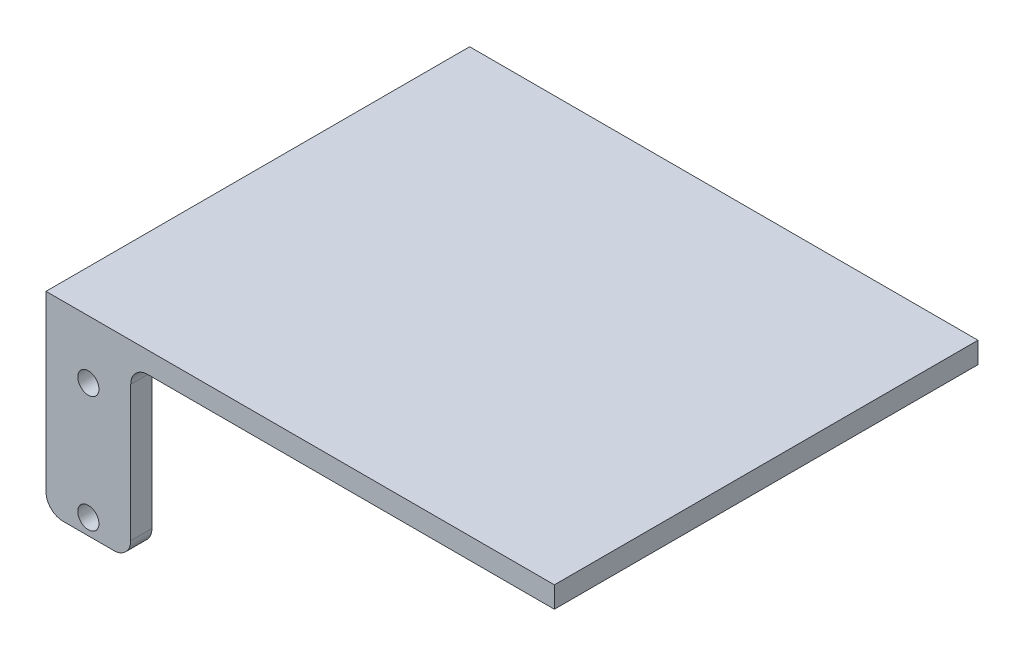
ISO-10303-21;
HEADER;
FILE_DESCRIPTION(('STEP AP214'),'2;1');
FILE_NAME('part.step','',(''),(''),'','','');
FILE_SCHEMA(('AUTOMOTIVE_DESIGN { 1 0 10303 214 1 1 1 1 }'));
ENDSEC;
DATA;
#1=APPLICATION_CONTEXT('core data for automotive mechanical design processes');
#2=APPLICATION_PROTOCOL_DEFINITION('international standard','automotive_design',2000,#1);
#3=PRODUCT_CONTEXT('',#1,'mechanical');
#4=PRODUCT('Part','Part','',(#3));
#5=PRODUCT_RELATED_PRODUCT_CATEGORY('part','',(#4));
#6=PRODUCT_DEFINITION_FORMATION('','',#4);
#7=PRODUCT_DEFINITION_CONTEXT('part definition',#1,'design');
#8=PRODUCT_DEFINITION('design','',#6,#7);
#9=PRODUCT_DEFINITION_SHAPE('','',#8);
#10=(LENGTH_UNIT() NAMED_UNIT(*) SI_UNIT(.MILLI.,.METRE.));
#11=(NAMED_UNIT(*) PLANE_ANGLE_UNIT() SI_UNIT($,.RADIAN.));
#12=(NAMED_UNIT(*) SI_UNIT($,.STERADIAN.) SOLID_ANGLE_UNIT());
#13=UNCERTAINTY_MEASURE_WITH_UNIT(LENGTH_MEASURE(1.E-05),#10,'distance_accuracy_value','');
#14=(GEOMETRIC_REPRESENTATION_CONTEXT(3) GLOBAL_UNCERTAINTY_ASSIGNED_CONTEXT((#13)) GLOBAL_UNIT_ASSIGNED_CONTEXT((#10,
#11,#12)) REPRESENTATION_CONTEXT('',''));
#15=CARTESIAN_POINT('',(0.,0.,0.));
#16=DIRECTION('',(0.,0.,1.));
#17=DIRECTION('',(1.,0.,0.));
#18=AXIS2_PLACEMENT_3D('',#15,#16,#17);
#19=CARTESIAN_POINT('',(0.,-3.175,0.));
#20=DIRECTION('',(0.,1.,0.));
#21=DIRECTION('',(0.,0.,1.));
#22=AXIS2_PLACEMENT_3D('',#19,#20,#21);
#23=PLANE('',#22);
#24=DIRECTION('',(1.,0.,0.));
#25=VECTOR('',#24,1.);
#26=CARTESIAN_POINT('',(38.1,-3.175,31.75));
#27=LINE('',#26,#25);
#28=CARTESIAN_POINT('',(-22.86,-3.175,31.75));
#29=VERTEX_POINT('',#28);
#30=CARTESIAN_POINT('',(38.1,-3.175,31.75));
#31=VERTEX_POINT('',#30);
#32=EDGE_CURVE('E182',#29,#31,#27,.T.);
#33=ORIENTED_EDGE('',*,*,#32,.F.);
#34=DIRECTION('',(0.,0.,1.));
#35=VECTOR('',#34,1.);
#36=CARTESIAN_POINT('',(-22.86,-3.175,0.));
#37=LINE('',#36,#35);
#38=CARTESIAN_POINT('',(-22.86,-3.175,28.575));
#39=VERTEX_POINT('',#38);
#40=EDGE_CURVE('E222',#29,#39,#37,.F.);
#41=ORIENTED_EDGE('',*,*,#40,.T.);
#42=DIRECTION('',(-1.,0.,0.));
#43=VECTOR('',#42,1.);
#44=CARTESIAN_POINT('',(-38.1,-3.175,28.575));
#45=LINE('',#44,#43);
#46=CARTESIAN_POINT('',(-38.1,-3.175,28.575));
#47=VERTEX_POINT('',#46);
#48=EDGE_CURVE('E181',#39,#47,#45,.T.);
#49=ORIENTED_EDGE('',*,*,#48,.T.);
#50=DIRECTION('',(0.,0.,1.));
#51=VECTOR('',#50,1.);
#52=CARTESIAN_POINT('',(-38.1,-3.175,31.75));
#53=LINE('',#52,#51);
#54=CARTESIAN_POINT('',(-38.1,-3.175,-28.575));
#55=VERTEX_POINT('',#54);
#56=EDGE_CURVE('E172',#55,#47,#53,.T.);
#57=ORIENTED_EDGE('',*,*,#56,.F.);
#58=DIRECTION('',(-1.,0.,0.));
#59=VECTOR('',#58,1.);
#60=CARTESIAN_POINT('',(-38.1,-3.175,-28.575));
#61=LINE('',#60,#59);
#62=CARTESIAN_POINT('',(-22.86,-3.175,-28.575));
#63=VERTEX_POINT('',#62);
#64=EDGE_CURVE('E153',#63,#55,#61,.T.);
#65=ORIENTED_EDGE('',*,*,#64,.F.);
#66=DIRECTION('',(0.,0.,-1.));
#67=VECTOR('',#66,1.);
#68=CARTESIAN_POINT('',(-22.86,-3.175,-31.75));
#69=LINE('',#68,#67);
#70=CARTESIAN_POINT('',(-22.86,-3.175,-31.75));
#71=VERTEX_POINT('',#70);
#72=EDGE_CURVE('E220',#63,#71,#69,.T.);
#73=ORIENTED_EDGE('',*,*,#72,.T.);
#74=DIRECTION('',(-1.,0.,0.));
#75=VECTOR('',#74,1.);
#76=CARTESIAN_POINT('',(38.1,-3.175,-31.75));
#77=LINE('',#76,#75);
#78=CARTESIAN_POINT('',(38.1,-3.175,-31.75));
#79=VERTEX_POINT('',#78);
#80=EDGE_CURVE('E196',#79,#71,#77,.T.);
#81=ORIENTED_EDGE('',*,*,#80,.F.);
#82=DIRECTION('',(0.,0.,-1.));
#83=VECTOR('',#82,1.);
#84=CARTESIAN_POINT('',(38.1,-3.175,31.75));
#85=LINE('',#84,#83);
#86=EDGE_CURVE('E185',#31,#79,#85,.T.);
#87=ORIENTED_EDGE('',*,*,#86,.F.);
#88=EDGE_LOOP('',(#33,#41,#49,#57,#65,#73,#81,#87));
#89=FACE_BOUND('',#88,.T.);
#90=ADVANCED_FACE('F39',(#89),#23,.F.);
#91=CARTESIAN_POINT('',(-38.1,-3.175,31.75));
#92=DIRECTION('',(-1.,0.,0.));
#93=DIRECTION('',(0.,0.,1.));
#94=AXIS2_PLACEMENT_3D('',#91,#92,#93);
#95=PLANE('',#94);
#96=DIRECTION('',(0.,1.,0.));
#97=VECTOR('',#96,1.);
#98=CARTESIAN_POINT('',(-38.1,-3.175,-31.75));
#99=LINE('',#98,#97);
#100=CARTESIAN_POINT('',(-38.1,-26.035,-31.75));
#101=VERTEX_POINT('',#100);
#102=CARTESIAN_POINT('',(-38.1,0.,-31.75));
#103=VERTEX_POINT('',#102);
#104=EDGE_CURVE('E208',#101,#103,#99,.T.);
#105=ORIENTED_EDGE('',*,*,#104,.F.);
#106=DIRECTION('',(0.,0.,-1.));
#107=VECTOR('',#106,1.);
#108=CARTESIAN_POINT('',(-38.1,-26.035,-28.575));
#109=LINE('',#108,#107);
#110=CARTESIAN_POINT('',(-38.1,-26.035,-28.575));
#111=VERTEX_POINT('',#110);
#112=EDGE_CURVE('E175',#101,#111,#109,.F.);
#113=ORIENTED_EDGE('',*,*,#112,.T.);
#114=DIRECTION('',(0.,-1.,0.));
#115=VECTOR('',#114,1.);
#116=CARTESIAN_POINT('',(-38.1,-3.175,-28.575));
#117=LINE('',#116,#115);
#118=EDGE_CURVE('E158',#55,#111,#117,.T.);
#119=ORIENTED_EDGE('',*,*,#118,.F.);
#120=ORIENTED_EDGE('',*,*,#56,.T.);
#121=DIRECTION('',(0.,-1.,0.));
#122=VECTOR('',#121,1.);
#123=CARTESIAN_POINT('',(-38.1,-3.175,28.575));
#124=LINE('',#123,#122);
#125=CARTESIAN_POINT('',(-38.1,-26.035,28.575));
#126=VERTEX_POINT('',#125);
#127=EDGE_CURVE('E302',#47,#126,#124,.T.);
#128=ORIENTED_EDGE('',*,*,#127,.T.);
#129=DIRECTION('',(0.,0.,1.));
#130=VECTOR('',#129,1.);
#131=CARTESIAN_POINT('',(-38.1,-26.035,31.75));
#132=LINE('',#131,#130);
#133=CARTESIAN_POINT('',(-38.1,-26.035,31.75));
#134=VERTEX_POINT('',#133);
#135=EDGE_CURVE('E242',#126,#134,#132,.T.);
#136=ORIENTED_EDGE('',*,*,#135,.T.);
#137=DIRECTION('',(0.,1.,0.));
#138=VECTOR('',#137,1.);
#139=CARTESIAN_POINT('',(-38.1,-3.175,31.75));
#140=LINE('',#139,#138);
#141=CARTESIAN_POINT('',(-38.1,0.,31.75));
#142=VERTEX_POINT('',#141);
#143=EDGE_CURVE('E199',#134,#142,#140,.T.);
#144=ORIENTED_EDGE('',*,*,#143,.T.);
#145=DIRECTION('',(0.,0.,1.));
#146=VECTOR('',#145,1.);
#147=CARTESIAN_POINT('',(-38.1,0.,31.75));
#148=LINE('',#147,#146);
#149=EDGE_CURVE('E200',#103,#142,#148,.T.);
#150=ORIENTED_EDGE('',*,*,#149,.F.);
#151=EDGE_LOOP('',(#105,#113,#119,#120,#128,#136,#144,#150));
#152=FACE_BOUND('',#151,.T.);
#153=ADVANCED_FACE('F170',(#152),#95,.T.);
#154=CARTESIAN_POINT('',(38.1,-3.175,-31.75));
#155=DIRECTION('',(0.,0.,-1.));
#156=DIRECTION('',(-1.,0.,0.));
#157=AXIS2_PLACEMENT_3D('',#154,#155,#156);
#158=PLANE('',#157);
#159=DIRECTION('',(0.,1.,0.));
#160=VECTOR('',#159,1.);
#161=CARTESIAN_POINT('',(-25.4,-3.175,-31.75));
#162=LINE('',#161,#160);
#163=CARTESIAN_POINT('',(-25.4,-26.035,-31.75));
#164=VERTEX_POINT('',#163);
#165=CARTESIAN_POINT('',(-25.4,-5.715,-31.75));
#166=VERTEX_POINT('',#165);
#167=EDGE_CURVE('E265',#164,#166,#162,.T.);
#168=ORIENTED_EDGE('',*,*,#167,.F.);
#169=CARTESIAN_POINT('',(-27.94,-26.035,-31.75));
#170=DIRECTION('',(0.,0.,-1.));
#171=DIRECTION('',(-1.,0.,0.));
#172=AXIS2_PLACEMENT_3D('',#169,#170,#171);
#173=CIRCLE('',#172,2.54);
#174=CARTESIAN_POINT('',(-27.94,-28.575,-31.75));
#175=VERTEX_POINT('',#174);
#176=EDGE_CURVE('E231',#164,#175,#173,.T.);
#177=ORIENTED_EDGE('',*,*,#176,.T.);
#178=DIRECTION('',(1.,0.,0.));
#179=VECTOR('',#178,1.);
#180=CARTESIAN_POINT('',(-38.1,-28.575,-31.75));
#181=LINE('',#180,#179);
#182=CARTESIAN_POINT('',(-35.56,-28.575,-31.75));
#183=VERTEX_POINT('',#182);
#184=EDGE_CURVE('E176',#183,#175,#181,.T.);
#185=ORIENTED_EDGE('',*,*,#184,.F.);
#186=CARTESIAN_POINT('',(-35.56,-26.035,-31.75));
#187=DIRECTION('',(0.,0.,-1.));
#188=DIRECTION('',(-1.,0.,0.));
#189=AXIS2_PLACEMENT_3D('',#186,#187,#188);
#190=CIRCLE('',#189,2.54);
#191=EDGE_CURVE('E229',#183,#101,#190,.T.);
#192=ORIENTED_EDGE('',*,*,#191,.T.);
#193=ORIENTED_EDGE('',*,*,#104,.T.);
#194=DIRECTION('',(-1.,0.,0.));
#195=VECTOR('',#194,1.);
#196=CARTESIAN_POINT('',(38.1,0.,-31.75));
#197=LINE('',#196,#195);
#198=CARTESIAN_POINT('',(38.1,0.,-31.75));
#199=VERTEX_POINT('',#198);
#200=EDGE_CURVE('E183',#199,#103,#197,.T.);
#201=ORIENTED_EDGE('',*,*,#200,.F.);
#202=DIRECTION('',(0.,1.,0.));
#203=VECTOR('',#202,1.);
#204=CARTESIAN_POINT('',(38.1,-3.175,-31.75));
#205=LINE('',#204,#203);
#206=EDGE_CURVE('E211',#79,#199,#205,.T.);
#207=ORIENTED_EDGE('',*,*,#206,.F.);
#208=ORIENTED_EDGE('',*,*,#80,.T.);
#209=CARTESIAN_POINT('',(-22.86,-5.715,-31.75));
#210=DIRECTION('',(0.,0.,-1.));
#211=DIRECTION('',(-1.,0.,0.));
#212=AXIS2_PLACEMENT_3D('',#209,#210,#211);
#213=CIRCLE('',#212,2.54);
#214=EDGE_CURVE('E47',#71,#166,#213,.F.);
#215=ORIENTED_EDGE('',*,*,#214,.T.);
#216=EDGE_LOOP('',(#168,#177,#185,#192,#193,#201,#207,#208,#215));
#217=FACE_BOUND('',#216,.T.);
#218=CARTESIAN_POINT('',(-31.75,-26.19375,-31.75));
#219=DIRECTION('',(0.,0.,1.));
#220=DIRECTION('',(1.,0.,0.));
#221=AXIS2_PLACEMENT_3D('',#218,#219,#220);
#222=CIRCLE('',#221,1.5875);
#223=CARTESIAN_POINT('',(-30.1625,-26.19375,-31.75));
#224=VERTEX_POINT('',#223);
#225=EDGE_CURVE('E550',#224,#224,#222,.T.);
#226=ORIENTED_EDGE('',*,*,#225,.T.);
#227=EDGE_LOOP('',(#226));
#228=FACE_BOUND('',#227,.T.);
#229=CARTESIAN_POINT('',(-31.75,-8.73125,-31.75));
#230=DIRECTION('',(0.,0.,1.));
#231=DIRECTION('',(1.,0.,0.));
#232=AXIS2_PLACEMENT_3D('',#229,#230,#231);
#233=CIRCLE('',#232,1.5875);
#234=CARTESIAN_POINT('',(-30.1625,-8.73125,-31.75));
#235=VERTEX_POINT('',#234);
#236=EDGE_CURVE('E555',#235,#235,#233,.T.);
#237=ORIENTED_EDGE('',*,*,#236,.T.);
#238=EDGE_LOOP('',(#237));
#239=FACE_BOUND('',#238,.T.);
#240=ADVANCED_FACE('F263',(#217,#228,#239),#158,.T.);
#241=CARTESIAN_POINT('',(38.1,-3.175,31.75));
#242=DIRECTION('',(1.,0.,0.));
#243=DIRECTION('',(0.,0.,-1.));
#244=AXIS2_PLACEMENT_3D('',#241,#242,#243);
#245=PLANE('',#244);
#246=DIRECTION('',(0.,0.,-1.));
#247=VECTOR('',#246,1.);
#248=CARTESIAN_POINT('',(38.1,0.,31.75));
#249=LINE('',#248,#247);
#250=CARTESIAN_POINT('',(38.1,0.,31.75));
#251=VERTEX_POINT('',#250);
#252=EDGE_CURVE('E188',#251,#199,#249,.T.);
#253=ORIENTED_EDGE('',*,*,#252,.F.);
#254=DIRECTION('',(0.,1.,0.));
#255=VECTOR('',#254,1.);
#256=CARTESIAN_POINT('',(38.1,-3.175,31.75));
#257=LINE('',#256,#255);
#258=EDGE_CURVE('E213',#31,#251,#257,.T.);
#259=ORIENTED_EDGE('',*,*,#258,.F.);
#260=ORIENTED_EDGE('',*,*,#86,.T.);
#261=ORIENTED_EDGE('',*,*,#206,.T.);
#262=EDGE_LOOP('',(#253,#259,#260,#261));
#263=FACE_BOUND('',#262,.T.);
#264=ADVANCED_FACE('F281',(#263),#245,.T.);
#265=CARTESIAN_POINT('',(38.1,-3.175,31.75));
#266=DIRECTION('',(0.,0.,1.));
#267=DIRECTION('',(1.,0.,0.));
#268=AXIS2_PLACEMENT_3D('',#265,#266,#267);
#269=PLANE('',#268);
#270=DIRECTION('',(1.,0.,0.));
#271=VECTOR('',#270,1.);
#272=CARTESIAN_POINT('',(-38.1,-28.575,31.75));
#273=LINE('',#272,#271);
#274=CARTESIAN_POINT('',(-35.56,-28.575,31.75));
#275=VERTEX_POINT('',#274);
#276=CARTESIAN_POINT('',(-27.94,-28.575,31.75));
#277=VERTEX_POINT('',#276);
#278=EDGE_CURVE('E305',#275,#277,#273,.T.);
#279=ORIENTED_EDGE('',*,*,#278,.T.);
#280=CARTESIAN_POINT('',(-27.94,-26.035,31.75));
#281=DIRECTION('',(0.,0.,1.));
#282=DIRECTION('',(1.,0.,0.));
#283=AXIS2_PLACEMENT_3D('',#280,#281,#282);
#284=CIRCLE('',#283,2.54);
#285=CARTESIAN_POINT('',(-25.4,-26.035,31.75));
#286=VERTEX_POINT('',#285);
#287=EDGE_CURVE('E252',#277,#286,#284,.T.);
#288=ORIENTED_EDGE('',*,*,#287,.T.);
#289=DIRECTION('',(0.,1.,0.));
#290=VECTOR('',#289,1.);
#291=CARTESIAN_POINT('',(-25.4,-3.175,31.75));
#292=LINE('',#291,#290);
#293=CARTESIAN_POINT('',(-25.4,-5.715,31.75));
#294=VERTEX_POINT('',#293);
#295=EDGE_CURVE('E191',#286,#294,#292,.T.);
#296=ORIENTED_EDGE('',*,*,#295,.T.);
#297=CARTESIAN_POINT('',(-22.86,-5.715,31.75));
#298=DIRECTION('',(0.,0.,1.));
#299=DIRECTION('',(1.,0.,0.));
#300=AXIS2_PLACEMENT_3D('',#297,#298,#299);
#301=CIRCLE('',#300,2.54);
#302=EDGE_CURVE('E257',#294,#29,#301,.F.);
#303=ORIENTED_EDGE('',*,*,#302,.T.);
#304=ORIENTED_EDGE('',*,*,#32,.T.);
#305=ORIENTED_EDGE('',*,*,#258,.T.);
#306=DIRECTION('',(1.,0.,0.));
#307=VECTOR('',#306,1.);
#308=CARTESIAN_POINT('',(38.1,0.,31.75));
#309=LINE('',#308,#307);
#310=EDGE_CURVE('E203',#142,#251,#309,.T.);
#311=ORIENTED_EDGE('',*,*,#310,.F.);
#312=ORIENTED_EDGE('',*,*,#143,.F.);
#313=CARTESIAN_POINT('',(-35.56,-26.035,31.75));
#314=DIRECTION('',(0.,0.,1.));
#315=DIRECTION('',(1.,0.,0.));
#316=AXIS2_PLACEMENT_3D('',#313,#314,#315);
#317=CIRCLE('',#316,2.54);
#318=EDGE_CURVE('E250',#134,#275,#317,.T.);
#319=ORIENTED_EDGE('',*,*,#318,.T.);
#320=EDGE_LOOP('',(#279,#288,#296,#303,#304,#305,#311,#312,#319));
#321=FACE_BOUND('',#320,.T.);
#322=CARTESIAN_POINT('',(-31.75,-8.73125,31.75));
#323=DIRECTION('',(0.,0.,1.));
#324=DIRECTION('',(1.,0.,0.));
#325=AXIS2_PLACEMENT_3D('',#322,#323,#324);
#326=CIRCLE('',#325,1.5875);
#327=CARTESIAN_POINT('',(-30.1625,-8.73125,31.75));
#328=VERTEX_POINT('',#327);
#329=EDGE_CURVE('E316',#328,#328,#326,.T.);
#330=ORIENTED_EDGE('',*,*,#329,.F.);
#331=EDGE_LOOP('',(#330));
#332=FACE_BOUND('',#331,.T.);
#333=CARTESIAN_POINT('',(-31.75,-26.19375,31.75));
#334=DIRECTION('',(0.,0.,1.));
#335=DIRECTION('',(1.,0.,0.));
#336=AXIS2_PLACEMENT_3D('',#333,#334,#335);
#337=CIRCLE('',#336,1.5875);
#338=CARTESIAN_POINT('',(-30.1625,-26.19375,31.75));
#339=VERTEX_POINT('',#338);
#340=EDGE_CURVE('E308',#339,#339,#337,.T.);
#341=ORIENTED_EDGE('',*,*,#340,.F.);
#342=EDGE_LOOP('',(#341));
#343=FACE_BOUND('',#342,.T.);
#344=ADVANCED_FACE('F285',(#321,#332,#343),#269,.T.);
#345=CARTESIAN_POINT('',(0.,0.,0.));
#346=DIRECTION('',(0.,1.,0.));
#347=DIRECTION('',(0.,0.,1.));
#348=AXIS2_PLACEMENT_3D('',#345,#346,#347);
#349=PLANE('',#348);
#350=ORIENTED_EDGE('',*,*,#149,.T.);
#351=ORIENTED_EDGE('',*,*,#310,.T.);
#352=ORIENTED_EDGE('',*,*,#252,.T.);
#353=ORIENTED_EDGE('',*,*,#200,.T.);
#354=EDGE_LOOP('',(#350,#351,#352,#353));
#355=FACE_BOUND('',#354,.T.);
#356=ADVANCED_FACE('F344',(#355),#349,.T.);
#357=CARTESIAN_POINT('',(-25.4,-3.175,28.575));
#358=DIRECTION('',(1.,0.,0.));
#359=DIRECTION('',(0.,1.,0.));
#360=AXIS2_PLACEMENT_3D('',#357,#358,#359);
#361=PLANE('',#360);
#362=DIRECTION('',(0.,1.,0.));
#363=VECTOR('',#362,1.);
#364=CARTESIAN_POINT('',(-25.4,-3.175,28.575));
#365=LINE('',#364,#363);
#366=CARTESIAN_POINT('',(-25.4,-26.035,28.575));
#367=VERTEX_POINT('',#366);
#368=CARTESIAN_POINT('',(-25.4,-5.715,28.575));
#369=VERTEX_POINT('',#368);
#370=EDGE_CURVE('E298',#367,#369,#365,.T.);
#371=ORIENTED_EDGE('',*,*,#370,.T.);
#372=DIRECTION('',(0.,0.,1.));
#373=VECTOR('',#372,1.);
#374=CARTESIAN_POINT('',(-25.4,-5.715,28.575));
#375=LINE('',#374,#373);
#376=EDGE_CURVE('E217',#369,#294,#375,.T.);
#377=ORIENTED_EDGE('',*,*,#376,.T.);
#378=ORIENTED_EDGE('',*,*,#295,.F.);
#379=DIRECTION('',(0.,0.,1.));
#380=VECTOR('',#379,1.);
#381=CARTESIAN_POINT('',(-25.4,-26.035,28.575));
#382=LINE('',#381,#380);
#383=EDGE_CURVE('E210',#286,#367,#382,.F.);
#384=ORIENTED_EDGE('',*,*,#383,.T.);
#385=EDGE_LOOP('',(#371,#377,#378,#384));
#386=FACE_BOUND('',#385,.T.);
#387=ADVANCED_FACE('F296',(#386),#361,.T.);
#388=CARTESIAN_POINT('',(-38.1,-28.575,28.575));
#389=DIRECTION('',(0.,-1.,0.));
#390=DIRECTION('',(0.,0.,-1.));
#391=AXIS2_PLACEMENT_3D('',#388,#389,#390);
#392=PLANE('',#391);
#393=DIRECTION('',(1.,0.,0.));
#394=VECTOR('',#393,1.);
#395=CARTESIAN_POINT('',(-38.1,-28.575,28.575));
#396=LINE('',#395,#394);
#397=CARTESIAN_POINT('',(-35.56,-28.575,28.575));
#398=VERTEX_POINT('',#397);
#399=CARTESIAN_POINT('',(-27.94,-28.575,28.575));
#400=VERTEX_POINT('',#399);
#401=EDGE_CURVE('E299',#398,#400,#396,.T.);
#402=ORIENTED_EDGE('',*,*,#401,.T.);
#403=DIRECTION('',(0.,0.,1.));
#404=VECTOR('',#403,1.);
#405=CARTESIAN_POINT('',(-27.94,-28.575,28.575));
#406=LINE('',#405,#404);
#407=EDGE_CURVE('E247',#400,#277,#406,.T.);
#408=ORIENTED_EDGE('',*,*,#407,.T.);
#409=ORIENTED_EDGE('',*,*,#278,.F.);
#410=DIRECTION('',(0.,0.,1.));
#411=VECTOR('',#410,1.);
#412=CARTESIAN_POINT('',(-35.56,-28.575,28.575));
#413=LINE('',#412,#411);
#414=EDGE_CURVE('E61',#275,#398,#413,.F.);
#415=ORIENTED_EDGE('',*,*,#414,.T.);
#416=EDGE_LOOP('',(#402,#408,#409,#415));
#417=FACE_BOUND('',#416,.T.);
#418=ADVANCED_FACE('F321',(#417),#392,.T.);
#419=CARTESIAN_POINT('',(0.,0.,28.575));
#420=DIRECTION('',(0.,0.,1.));
#421=DIRECTION('',(1.,0.,0.));
#422=AXIS2_PLACEMENT_3D('',#419,#420,#421);
#423=PLANE('',#422);
#424=CARTESIAN_POINT('',(-31.75,-8.73125,28.575));
#425=DIRECTION('',(0.,0.,1.));
#426=DIRECTION('',(1.,0.,0.));
#427=AXIS2_PLACEMENT_3D('',#424,#425,#426);
#428=CIRCLE('',#427,1.5875);
#429=CARTESIAN_POINT('',(-30.1625,-8.73125,28.575));
#430=VERTEX_POINT('',#429);
#431=EDGE_CURVE('E313',#430,#430,#428,.T.);
#432=ORIENTED_EDGE('',*,*,#431,.T.);
#433=EDGE_LOOP('',(#432));
#434=FACE_BOUND('',#433,.T.);
#435=CARTESIAN_POINT('',(-31.75,-26.19375,28.575));
#436=DIRECTION('',(0.,0.,1.));
#437=DIRECTION('',(1.,0.,0.));
#438=AXIS2_PLACEMENT_3D('',#435,#436,#437);
#439=CIRCLE('',#438,1.5875);
#440=CARTESIAN_POINT('',(-30.1625,-26.19375,28.575));
#441=VERTEX_POINT('',#440);
#442=EDGE_CURVE('E306',#441,#441,#439,.T.);
#443=ORIENTED_EDGE('',*,*,#442,.T.);
#444=EDGE_LOOP('',(#443));
#445=FACE_BOUND('',#444,.T.);
#446=ORIENTED_EDGE('',*,*,#370,.F.);
#447=CARTESIAN_POINT('',(-27.94,-26.035,28.575));
#448=DIRECTION('',(0.,0.,1.));
#449=DIRECTION('',(1.,0.,0.));
#450=AXIS2_PLACEMENT_3D('',#447,#448,#449);
#451=CIRCLE('',#450,2.54);
#452=EDGE_CURVE('E54',#367,#400,#451,.F.);
#453=ORIENTED_EDGE('',*,*,#452,.T.);
#454=ORIENTED_EDGE('',*,*,#401,.F.);
#455=CARTESIAN_POINT('',(-35.56,-26.035,28.575));
#456=DIRECTION('',(0.,0.,1.));
#457=DIRECTION('',(1.,0.,0.));
#458=AXIS2_PLACEMENT_3D('',#455,#456,#457);
#459=CIRCLE('',#458,2.54);
#460=EDGE_CURVE('E254',#398,#126,#459,.F.);
#461=ORIENTED_EDGE('',*,*,#460,.T.);
#462=ORIENTED_EDGE('',*,*,#127,.F.);
#463=ORIENTED_EDGE('',*,*,#48,.F.);
#464=CARTESIAN_POINT('',(-22.86,-5.715,28.575));
#465=DIRECTION('',(0.,0.,1.));
#466=DIRECTION('',(1.,0.,0.));
#467=AXIS2_PLACEMENT_3D('',#464,#465,#466);
#468=CIRCLE('',#467,2.54);
#469=EDGE_CURVE('E259',#39,#369,#468,.T.);
#470=ORIENTED_EDGE('',*,*,#469,.T.);
#471=EDGE_LOOP('',(#446,#453,#454,#461,#462,#463,#470));
#472=FACE_BOUND('',#471,.T.);
#473=ADVANCED_FACE('F383',(#434,#445,#472),#423,.F.);
#474=CARTESIAN_POINT('',(-31.75,-26.19375,28.575));
#475=DIRECTION('',(0.,0.,1.));
#476=DIRECTION('',(1.,0.,0.));
#477=AXIS2_PLACEMENT_3D('',#474,#475,#476);
#478=CYLINDRICAL_SURFACE('',#477,1.5875);
#479=ORIENTED_EDGE('',*,*,#442,.F.);
#480=EDGE_LOOP('',(#479));
#481=FACE_BOUND('',#480,.T.);
#482=ORIENTED_EDGE('',*,*,#340,.T.);
#483=EDGE_LOOP('',(#482));
#484=FACE_BOUND('',#483,.T.);
#485=ADVANCED_FACE('F381',(#481,#484),#478,.F.);
#486=CARTESIAN_POINT('',(-31.75,-8.73125,28.575));
#487=DIRECTION('',(0.,0.,1.));
#488=DIRECTION('',(1.,0.,0.));
#489=AXIS2_PLACEMENT_3D('',#486,#487,#488);
#490=CYLINDRICAL_SURFACE('',#489,1.5875);
#491=ORIENTED_EDGE('',*,*,#431,.F.);
#492=EDGE_LOOP('',(#491));
#493=FACE_BOUND('',#492,.T.);
#494=ORIENTED_EDGE('',*,*,#329,.T.);
#495=EDGE_LOOP('',(#494));
#496=FACE_BOUND('',#495,.T.);
#497=ADVANCED_FACE('F377',(#493,#496),#490,.F.);
#498=CARTESIAN_POINT('',(0.,0.,-28.575));
#499=DIRECTION('',(0.,0.,-1.));
#500=DIRECTION('',(1.,0.,0.));
#501=AXIS2_PLACEMENT_3D('',#498,#499,#500);
#502=PLANE('',#501);
#503=DIRECTION('',(1.,0.,0.));
#504=VECTOR('',#503,1.);
#505=CARTESIAN_POINT('',(-38.1,-28.575,-28.575));
#506=LINE('',#505,#504);
#507=CARTESIAN_POINT('',(-35.56,-28.575,-28.575));
#508=VERTEX_POINT('',#507);
#509=CARTESIAN_POINT('',(-27.94,-28.575,-28.575));
#510=VERTEX_POINT('',#509);
#511=EDGE_CURVE('E366',#508,#510,#506,.T.);
#512=ORIENTED_EDGE('',*,*,#511,.T.);
#513=CARTESIAN_POINT('',(-27.94,-26.035,-28.575));
#514=DIRECTION('',(0.,0.,-1.));
#515=DIRECTION('',(-1.,0.,0.));
#516=AXIS2_PLACEMENT_3D('',#513,#514,#515);
#517=CIRCLE('',#516,2.54);
#518=CARTESIAN_POINT('',(-25.4,-26.035,-28.575));
#519=VERTEX_POINT('',#518);
#520=EDGE_CURVE('E240',#510,#519,#517,.F.);
#521=ORIENTED_EDGE('',*,*,#520,.T.);
#522=DIRECTION('',(0.,1.,0.));
#523=VECTOR('',#522,1.);
#524=CARTESIAN_POINT('',(-25.4,-3.175,-28.575));
#525=LINE('',#524,#523);
#526=CARTESIAN_POINT('',(-25.4,-5.715,-28.575));
#527=VERTEX_POINT('',#526);
#528=EDGE_CURVE('E166',#519,#527,#525,.T.);
#529=ORIENTED_EDGE('',*,*,#528,.T.);
#530=CARTESIAN_POINT('',(-22.86,-5.715,-28.575));
#531=DIRECTION('',(0.,0.,-1.));
#532=DIRECTION('',(-1.,0.,0.));
#533=AXIS2_PLACEMENT_3D('',#530,#531,#532);
#534=CIRCLE('',#533,2.54);
#535=EDGE_CURVE('E11',#527,#63,#534,.T.);
#536=ORIENTED_EDGE('',*,*,#535,.T.);
#537=ORIENTED_EDGE('',*,*,#64,.T.);
#538=ORIENTED_EDGE('',*,*,#118,.T.);
#539=CARTESIAN_POINT('',(-35.56,-26.035,-28.575));
#540=DIRECTION('',(0.,0.,-1.));
#541=DIRECTION('',(-1.,0.,0.));
#542=AXIS2_PLACEMENT_3D('',#539,#540,#541);
#543=CIRCLE('',#542,2.54);
#544=EDGE_CURVE('E238',#111,#508,#543,.F.);
#545=ORIENTED_EDGE('',*,*,#544,.T.);
#546=EDGE_LOOP('',(#512,#521,#529,#536,#537,#538,#545));
#547=FACE_BOUND('',#546,.T.);
#548=CARTESIAN_POINT('',(-31.75,-26.19375,-28.575));
#549=DIRECTION('',(0.,0.,1.));
#550=DIRECTION('',(1.,0.,0.));
#551=AXIS2_PLACEMENT_3D('',#548,#549,#550);
#552=CIRCLE('',#551,1.5875);
#553=CARTESIAN_POINT('',(-30.1625,-26.19375,-28.575));
#554=VERTEX_POINT('',#553);
#555=EDGE_CURVE('E273',#554,#554,#552,.T.);
#556=ORIENTED_EDGE('',*,*,#555,.F.);
#557=EDGE_LOOP('',(#556));
#558=FACE_BOUND('',#557,.T.);
#559=CARTESIAN_POINT('',(-31.75,-8.73125,-28.575));
#560=DIRECTION('',(0.,0.,1.));
#561=DIRECTION('',(1.,0.,0.));
#562=AXIS2_PLACEMENT_3D('',#559,#560,#561);
#563=CIRCLE('',#562,1.5875);
#564=CARTESIAN_POINT('',(-30.1625,-8.73125,-28.575));
#565=VERTEX_POINT('',#564);
#566=EDGE_CURVE('E551',#565,#565,#563,.T.);
#567=ORIENTED_EDGE('',*,*,#566,.F.);
#568=EDGE_LOOP('',(#567));
#569=FACE_BOUND('',#568,.T.);
#570=ADVANCED_FACE('F156',(#547,#558,#569),#502,.F.);
#571=CARTESIAN_POINT('',(-38.1,-28.575,-28.575));
#572=DIRECTION('',(0.,1.,0.));
#573=DIRECTION('',(0.,0.,1.));
#574=AXIS2_PLACEMENT_3D('',#571,#572,#573);
#575=PLANE('',#574);
#576=ORIENTED_EDGE('',*,*,#184,.T.);
#577=DIRECTION('',(0.,0.,-1.));
#578=VECTOR('',#577,1.);
#579=CARTESIAN_POINT('',(-27.94,-28.575,-28.575));
#580=LINE('',#579,#578);
#581=EDGE_CURVE('E236',#175,#510,#580,.F.);
#582=ORIENTED_EDGE('',*,*,#581,.T.);
#583=ORIENTED_EDGE('',*,*,#511,.F.);
#584=DIRECTION('',(0.,0.,-1.));
#585=VECTOR('',#584,1.);
#586=CARTESIAN_POINT('',(-35.56,-28.575,-31.75));
#587=LINE('',#586,#585);
#588=EDGE_CURVE('E233',#508,#183,#587,.T.);
#589=ORIENTED_EDGE('',*,*,#588,.T.);
#590=EDGE_LOOP('',(#576,#582,#583,#589));
#591=FACE_BOUND('',#590,.T.);
#592=ADVANCED_FACE('F412',(#591),#575,.F.);
#593=CARTESIAN_POINT('',(-25.4,-3.175,-28.575));
#594=DIRECTION('',(-1.,0.,0.));
#595=DIRECTION('',(0.,-1.,0.));
#596=AXIS2_PLACEMENT_3D('',#593,#594,#595);
#597=PLANE('',#596);
#598=ORIENTED_EDGE('',*,*,#167,.T.);
#599=DIRECTION('',(0.,0.,-1.));
#600=VECTOR('',#599,1.);
#601=CARTESIAN_POINT('',(-25.4,-5.715,-28.575));
#602=LINE('',#601,#600);
#603=EDGE_CURVE('E227',#166,#527,#602,.F.);
#604=ORIENTED_EDGE('',*,*,#603,.T.);
#605=ORIENTED_EDGE('',*,*,#528,.F.);
#606=DIRECTION('',(0.,0.,-1.));
#607=VECTOR('',#606,1.);
#608=CARTESIAN_POINT('',(-25.4,-26.035,-28.575));
#609=LINE('',#608,#607);
#610=EDGE_CURVE('E224',#519,#164,#609,.T.);
#611=ORIENTED_EDGE('',*,*,#610,.T.);
#612=EDGE_LOOP('',(#598,#604,#605,#611));
#613=FACE_BOUND('',#612,.T.);
#614=ADVANCED_FACE('F270',(#613),#597,.F.);
#615=CARTESIAN_POINT('',(-31.75,-26.19375,-28.575));
#616=DIRECTION('',(0.,0.,-1.));
#617=DIRECTION('',(-1.,0.,0.));
#618=AXIS2_PLACEMENT_3D('',#615,#616,#617);
#619=CYLINDRICAL_SURFACE('',#618,1.5875);
#620=ORIENTED_EDGE('',*,*,#555,.T.);
#621=EDGE_LOOP('',(#620));
#622=FACE_BOUND('',#621,.T.);
#623=ORIENTED_EDGE('',*,*,#225,.F.);
#624=EDGE_LOOP('',(#623));
#625=FACE_BOUND('',#624,.T.);
#626=ADVANCED_FACE('F428',(#622,#625),#619,.F.);
#627=CARTESIAN_POINT('',(-31.75,-8.73125,-28.575));
#628=DIRECTION('',(0.,0.,-1.));
#629=DIRECTION('',(-1.,0.,0.));
#630=AXIS2_PLACEMENT_3D('',#627,#628,#629);
#631=CYLINDRICAL_SURFACE('',#630,1.5875);
#632=ORIENTED_EDGE('',*,*,#566,.T.);
#633=EDGE_LOOP('',(#632));
#634=FACE_BOUND('',#633,.T.);
#635=ORIENTED_EDGE('',*,*,#236,.F.);
#636=EDGE_LOOP('',(#635));
#637=FACE_BOUND('',#636,.T.);
#638=ADVANCED_FACE('F356',(#634,#637),#631,.F.);
#639=CARTESIAN_POINT('',(-22.86,-5.715,28.575));
#640=DIRECTION('',(0.,0.,1.));
#641=DIRECTION('',(1.,0.,0.));
#642=AXIS2_PLACEMENT_3D('',#639,#640,#641);
#643=CYLINDRICAL_SURFACE('',#642,2.54);
#644=ORIENTED_EDGE('',*,*,#469,.F.);
#645=ORIENTED_EDGE('',*,*,#40,.F.);
#646=ORIENTED_EDGE('',*,*,#302,.F.);
#647=ORIENTED_EDGE('',*,*,#376,.F.);
#648=EDGE_LOOP('',(#644,#645,#646,#647));
#649=FACE_BOUND('',#648,.T.);
#650=ADVANCED_FACE('F293',(#649),#643,.F.);
#651=CARTESIAN_POINT('',(-22.86,-5.715,0.));
#652=DIRECTION('',(0.,0.,1.));
#653=DIRECTION('',(1.,0.,0.));
#654=AXIS2_PLACEMENT_3D('',#651,#652,#653);
#655=CYLINDRICAL_SURFACE('',#654,2.54);
#656=ORIENTED_EDGE('',*,*,#535,.F.);
#657=ORIENTED_EDGE('',*,*,#603,.F.);
#658=ORIENTED_EDGE('',*,*,#214,.F.);
#659=ORIENTED_EDGE('',*,*,#72,.F.);
#660=EDGE_LOOP('',(#656,#657,#658,#659));
#661=FACE_BOUND('',#660,.T.);
#662=ADVANCED_FACE('F275',(#661),#655,.F.);
#663=CARTESIAN_POINT('',(-27.94,-26.035,-28.575));
#664=DIRECTION('',(0.,0.,-1.));
#665=DIRECTION('',(-1.,0.,0.));
#666=AXIS2_PLACEMENT_3D('',#663,#664,#665);
#667=CYLINDRICAL_SURFACE('',#666,2.54);
#668=ORIENTED_EDGE('',*,*,#520,.F.);
#669=ORIENTED_EDGE('',*,*,#581,.F.);
#670=ORIENTED_EDGE('',*,*,#176,.F.);
#671=ORIENTED_EDGE('',*,*,#610,.F.);
#672=EDGE_LOOP('',(#668,#669,#670,#671));
#673=FACE_BOUND('',#672,.T.);
#674=ADVANCED_FACE('F331',(#673),#667,.T.);
#675=CARTESIAN_POINT('',(-35.56,-26.035,-28.575));
#676=DIRECTION('',(0.,0.,1.));
#677=DIRECTION('',(1.,0.,0.));
#678=AXIS2_PLACEMENT_3D('',#675,#676,#677);
#679=CYLINDRICAL_SURFACE('',#678,2.54);
#680=ORIENTED_EDGE('',*,*,#544,.F.);
#681=ORIENTED_EDGE('',*,*,#112,.F.);
#682=ORIENTED_EDGE('',*,*,#191,.F.);
#683=ORIENTED_EDGE('',*,*,#588,.F.);
#684=EDGE_LOOP('',(#680,#681,#682,#683));
#685=FACE_BOUND('',#684,.T.);
#686=ADVANCED_FACE('F326',(#685),#679,.T.);
#687=CARTESIAN_POINT('',(-27.94,-26.035,28.575));
#688=DIRECTION('',(0.,0.,1.));
#689=DIRECTION('',(1.,0.,0.));
#690=AXIS2_PLACEMENT_3D('',#687,#688,#689);
#691=CYLINDRICAL_SURFACE('',#690,2.54);
#692=ORIENTED_EDGE('',*,*,#452,.F.);
#693=ORIENTED_EDGE('',*,*,#383,.F.);
#694=ORIENTED_EDGE('',*,*,#287,.F.);
#695=ORIENTED_EDGE('',*,*,#407,.F.);
#696=EDGE_LOOP('',(#692,#693,#694,#695));
#697=FACE_BOUND('',#696,.T.);
#698=ADVANCED_FACE('F324',(#697),#691,.T.);
#699=CARTESIAN_POINT('',(-35.56,-26.035,31.75));
#700=DIRECTION('',(0.,0.,1.));
#701=DIRECTION('',(1.,0.,0.));
#702=AXIS2_PLACEMENT_3D('',#699,#700,#701);
#703=CYLINDRICAL_SURFACE('',#702,2.54);
#704=ORIENTED_EDGE('',*,*,#460,.F.);
#705=ORIENTED_EDGE('',*,*,#414,.F.);
#706=ORIENTED_EDGE('',*,*,#318,.F.);
#707=ORIENTED_EDGE('',*,*,#135,.F.);
#708=EDGE_LOOP('',(#704,#705,#706,#707));
#709=FACE_BOUND('',#708,.T.);
#710=ADVANCED_FACE('F41',(#709),#703,.T.);
#711=CLOSED_SHELL('',(#90,#153,#240,#264,#344,#356,#387,#418,#473,#485,#497,#570,#592,#614,#626,
#638,#650,#662,#674,#686,#698,#710));
#712=MANIFOLD_SOLID_BREP('B2',#711);
#713=ADVANCED_BREP_SHAPE_REPRESENTATION('',(#18,#712),#14);
#714=SHAPE_DEFINITION_REPRESENTATION(#9,#713);
ENDSEC;
END-ISO-10303-21;
